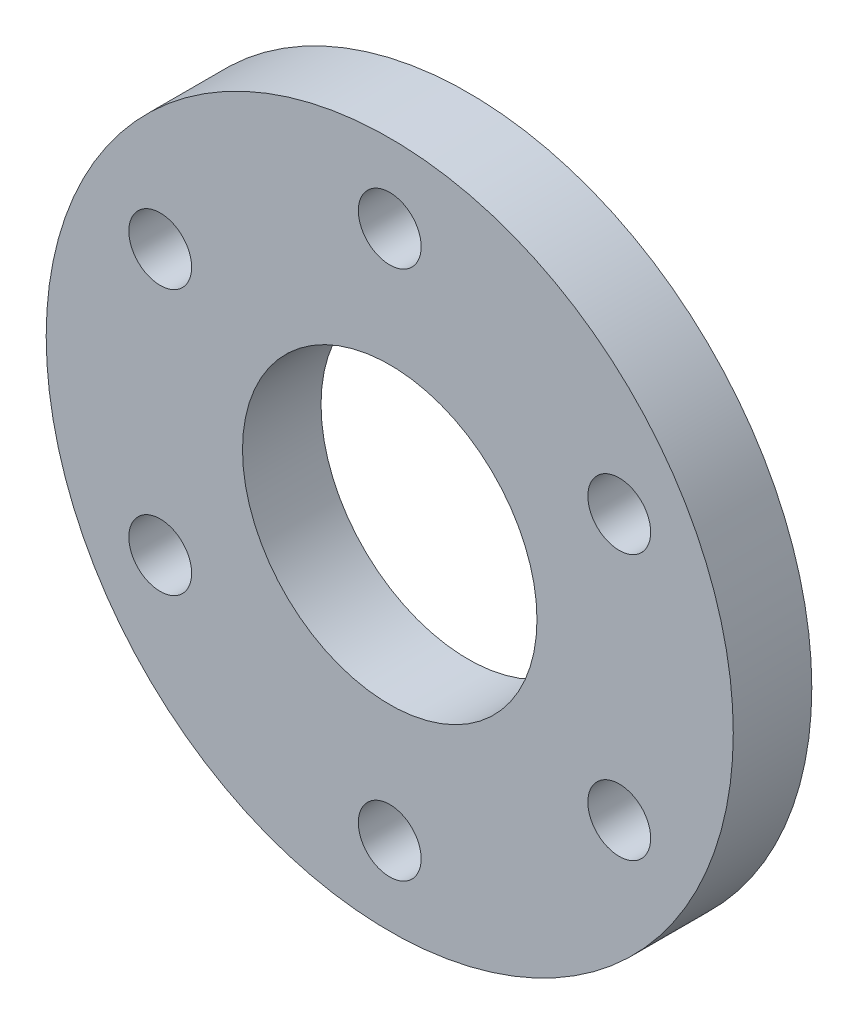
ISO-10303-21;
HEADER;
FILE_DESCRIPTION(('STEP AP214'),'2;1');
FILE_NAME('part.step','',(''),(''),'','','');
FILE_SCHEMA(('AUTOMOTIVE_DESIGN { 1 0 10303 214 1 1 1 1 }'));
ENDSEC;
DATA;
#1=APPLICATION_CONTEXT('core data for automotive mechanical design processes');
#2=APPLICATION_PROTOCOL_DEFINITION('international standard','automotive_design',2000,#1);
#3=PRODUCT_CONTEXT('',#1,'mechanical');
#4=PRODUCT('Part','Part','',(#3));
#5=PRODUCT_RELATED_PRODUCT_CATEGORY('part','',(#4));
#6=PRODUCT_DEFINITION_FORMATION('','',#4);
#7=PRODUCT_DEFINITION_CONTEXT('part definition',#1,'design');
#8=PRODUCT_DEFINITION('design','',#6,#7);
#9=PRODUCT_DEFINITION_SHAPE('','',#8);
#10=(LENGTH_UNIT() NAMED_UNIT(*) SI_UNIT(.MILLI.,.METRE.));
#11=(NAMED_UNIT(*) PLANE_ANGLE_UNIT() SI_UNIT($,.RADIAN.));
#12=(NAMED_UNIT(*) SI_UNIT($,.STERADIAN.) SOLID_ANGLE_UNIT());
#13=UNCERTAINTY_MEASURE_WITH_UNIT(LENGTH_MEASURE(1.E-05),#10,'distance_accuracy_value','');
#14=(GEOMETRIC_REPRESENTATION_CONTEXT(3) GLOBAL_UNCERTAINTY_ASSIGNED_CONTEXT((#13)) GLOBAL_UNIT_ASSIGNED_CONTEXT((#10,
#11,#12)) REPRESENTATION_CONTEXT('',''));
#15=CARTESIAN_POINT('',(0.,0.,0.));
#16=DIRECTION('',(0.,0.,1.));
#17=DIRECTION('',(1.,0.,0.));
#18=AXIS2_PLACEMENT_3D('',#15,#16,#17);
#19=CARTESIAN_POINT('',(0.,0.,4.));
#20=DIRECTION('',(0.,0.,1.));
#21=DIRECTION('',(1.,0.,0.));
#22=AXIS2_PLACEMENT_3D('',#19,#20,#21);
#23=PLANE('',#22);
#24=CARTESIAN_POINT('',(-11.6913429510899,-6.75000000000001,4.));
#25=DIRECTION('',(0.,0.,1.));
#26=DIRECTION('',(1.,0.,0.));
#27=AXIS2_PLACEMENT_3D('',#24,#25,#26);
#28=CIRCLE('',#27,1.6);
#29=CARTESIAN_POINT('',(-10.0913429510899,-6.75000000000001,4.));
#30=VERTEX_POINT('',#29);
#31=EDGE_CURVE('E79',#30,#30,#28,.T.);
#32=ORIENTED_EDGE('',*,*,#31,.F.);
#33=EDGE_LOOP('',(#32));
#34=FACE_BOUND('',#33,.T.);
#35=CARTESIAN_POINT('',(11.6913429510899,-6.75,4.));
#36=DIRECTION('',(0.,0.,1.));
#37=DIRECTION('',(1.,0.,0.));
#38=AXIS2_PLACEMENT_3D('',#35,#36,#37);
#39=CIRCLE('',#38,1.6);
#40=CARTESIAN_POINT('',(13.2913429510899,-6.75,4.));
#41=VERTEX_POINT('',#40);
#42=EDGE_CURVE('E67',#41,#41,#39,.T.);
#43=ORIENTED_EDGE('',*,*,#42,.F.);
#44=EDGE_LOOP('',(#43));
#45=FACE_BOUND('',#44,.T.);
#46=CARTESIAN_POINT('',(0.,13.5,4.));
#47=DIRECTION('',(0.,0.,1.));
#48=DIRECTION('',(1.,0.,0.));
#49=AXIS2_PLACEMENT_3D('',#46,#47,#48);
#50=CIRCLE('',#49,1.6);
#51=CARTESIAN_POINT('',(1.6,13.5,4.));
#52=VERTEX_POINT('',#51);
#53=EDGE_CURVE('E55',#52,#52,#50,.T.);
#54=ORIENTED_EDGE('',*,*,#53,.F.);
#55=EDGE_LOOP('',(#54));
#56=FACE_BOUND('',#55,.T.);
#57=CARTESIAN_POINT('',(0.,0.,4.));
#58=DIRECTION('',(0.,0.,1.));
#59=DIRECTION('',(1.,0.,0.));
#60=AXIS2_PLACEMENT_3D('',#57,#58,#59);
#61=CIRCLE('',#60,17.5);
#62=CARTESIAN_POINT('',(17.5,0.,4.));
#63=VERTEX_POINT('',#62);
#64=EDGE_CURVE('E10',#63,#63,#61,.T.);
#65=ORIENTED_EDGE('',*,*,#64,.T.);
#66=EDGE_LOOP('',(#65));
#67=FACE_BOUND('',#66,.T.);
#68=CARTESIAN_POINT('',(0.,0.,4.));
#69=DIRECTION('',(0.,0.,1.));
#70=DIRECTION('',(1.,0.,0.));
#71=AXIS2_PLACEMENT_3D('',#68,#69,#70);
#72=CIRCLE('',#71,7.5);
#73=CARTESIAN_POINT('',(7.5,0.,4.));
#74=VERTEX_POINT('',#73);
#75=EDGE_CURVE('E50',#74,#74,#72,.T.);
#76=ORIENTED_EDGE('',*,*,#75,.F.);
#77=EDGE_LOOP('',(#76));
#78=FACE_BOUND('',#77,.T.);
#79=CARTESIAN_POINT('',(11.6913429510899,6.75,4.));
#80=DIRECTION('',(0.,0.,1.));
#81=DIRECTION('',(1.,0.,0.));
#82=AXIS2_PLACEMENT_3D('',#79,#80,#81);
#83=CIRCLE('',#82,1.6);
#84=CARTESIAN_POINT('',(13.2913429510899,6.75,4.));
#85=VERTEX_POINT('',#84);
#86=EDGE_CURVE('E61',#85,#85,#83,.T.);
#87=ORIENTED_EDGE('',*,*,#86,.F.);
#88=EDGE_LOOP('',(#87));
#89=FACE_BOUND('',#88,.T.);
#90=CARTESIAN_POINT('',(0.,-13.5,4.));
#91=DIRECTION('',(0.,0.,1.));
#92=DIRECTION('',(1.,0.,0.));
#93=AXIS2_PLACEMENT_3D('',#90,#91,#92);
#94=CIRCLE('',#93,1.6);
#95=CARTESIAN_POINT('',(1.6,-13.5,4.));
#96=VERTEX_POINT('',#95);
#97=EDGE_CURVE('E73',#96,#96,#94,.T.);
#98=ORIENTED_EDGE('',*,*,#97,.F.);
#99=EDGE_LOOP('',(#98));
#100=FACE_BOUND('',#99,.T.);
#101=CARTESIAN_POINT('',(-11.6913429510899,6.75,4.));
#102=DIRECTION('',(0.,0.,1.));
#103=DIRECTION('',(1.,0.,0.));
#104=AXIS2_PLACEMENT_3D('',#101,#102,#103);
#105=CIRCLE('',#104,1.6);
#106=CARTESIAN_POINT('',(-10.0913429510899,6.75,4.));
#107=VERTEX_POINT('',#106);
#108=EDGE_CURVE('E85',#107,#107,#105,.T.);
#109=ORIENTED_EDGE('',*,*,#108,.F.);
#110=EDGE_LOOP('',(#109));
#111=FACE_BOUND('',#110,.T.);
#112=ADVANCED_FACE('F39',(#34,#45,#56,#67,#78,#89,#100,#111),#23,.T.);
#113=CARTESIAN_POINT('',(0.,0.,0.));
#114=DIRECTION('',(0.,0.,1.));
#115=DIRECTION('',(1.,0.,0.));
#116=AXIS2_PLACEMENT_3D('',#113,#114,#115);
#117=PLANE('',#116);
#118=CARTESIAN_POINT('',(0.,0.,0.));
#119=DIRECTION('',(0.,0.,1.));
#120=DIRECTION('',(1.,0.,0.));
#121=AXIS2_PLACEMENT_3D('',#118,#119,#120);
#122=CIRCLE('',#121,17.5);
#123=CARTESIAN_POINT('',(17.5,0.,0.));
#124=VERTEX_POINT('',#123);
#125=EDGE_CURVE('E43',#124,#124,#122,.T.);
#126=ORIENTED_EDGE('',*,*,#125,.F.);
#127=EDGE_LOOP('',(#126));
#128=FACE_BOUND('',#127,.T.);
#129=CARTESIAN_POINT('',(0.,0.,0.));
#130=DIRECTION('',(0.,0.,1.));
#131=DIRECTION('',(1.,0.,0.));
#132=AXIS2_PLACEMENT_3D('',#129,#130,#131);
#133=CIRCLE('',#132,7.5);
#134=CARTESIAN_POINT('',(7.5,0.,0.));
#135=VERTEX_POINT('',#134);
#136=EDGE_CURVE('E52',#135,#135,#133,.T.);
#137=ORIENTED_EDGE('',*,*,#136,.T.);
#138=EDGE_LOOP('',(#137));
#139=FACE_BOUND('',#138,.T.);
#140=CARTESIAN_POINT('',(0.,13.5,0.));
#141=DIRECTION('',(0.,0.,1.));
#142=DIRECTION('',(1.,0.,0.));
#143=AXIS2_PLACEMENT_3D('',#140,#141,#142);
#144=CIRCLE('',#143,1.6);
#145=CARTESIAN_POINT('',(1.6,13.5,0.));
#146=VERTEX_POINT('',#145);
#147=EDGE_CURVE('E58',#146,#146,#144,.T.);
#148=ORIENTED_EDGE('',*,*,#147,.T.);
#149=EDGE_LOOP('',(#148));
#150=FACE_BOUND('',#149,.T.);
#151=CARTESIAN_POINT('',(11.6913429510899,6.75,0.));
#152=DIRECTION('',(0.,0.,1.));
#153=DIRECTION('',(1.,0.,0.));
#154=AXIS2_PLACEMENT_3D('',#151,#152,#153);
#155=CIRCLE('',#154,1.6);
#156=CARTESIAN_POINT('',(13.2913429510899,6.75,0.));
#157=VERTEX_POINT('',#156);
#158=EDGE_CURVE('E64',#157,#157,#155,.T.);
#159=ORIENTED_EDGE('',*,*,#158,.T.);
#160=EDGE_LOOP('',(#159));
#161=FACE_BOUND('',#160,.T.);
#162=CARTESIAN_POINT('',(11.6913429510899,-6.75,0.));
#163=DIRECTION('',(0.,0.,1.));
#164=DIRECTION('',(1.,0.,0.));
#165=AXIS2_PLACEMENT_3D('',#162,#163,#164);
#166=CIRCLE('',#165,1.6);
#167=CARTESIAN_POINT('',(13.2913429510899,-6.75,0.));
#168=VERTEX_POINT('',#167);
#169=EDGE_CURVE('E70',#168,#168,#166,.T.);
#170=ORIENTED_EDGE('',*,*,#169,.T.);
#171=EDGE_LOOP('',(#170));
#172=FACE_BOUND('',#171,.T.);
#173=CARTESIAN_POINT('',(0.,-13.5,0.));
#174=DIRECTION('',(0.,0.,1.));
#175=DIRECTION('',(1.,0.,0.));
#176=AXIS2_PLACEMENT_3D('',#173,#174,#175);
#177=CIRCLE('',#176,1.6);
#178=CARTESIAN_POINT('',(1.6,-13.5,0.));
#179=VERTEX_POINT('',#178);
#180=EDGE_CURVE('E76',#179,#179,#177,.T.);
#181=ORIENTED_EDGE('',*,*,#180,.T.);
#182=EDGE_LOOP('',(#181));
#183=FACE_BOUND('',#182,.T.);
#184=CARTESIAN_POINT('',(-11.6913429510899,-6.75000000000001,0.));
#185=DIRECTION('',(0.,0.,1.));
#186=DIRECTION('',(1.,0.,0.));
#187=AXIS2_PLACEMENT_3D('',#184,#185,#186);
#188=CIRCLE('',#187,1.6);
#189=CARTESIAN_POINT('',(-10.0913429510899,-6.75000000000001,0.));
#190=VERTEX_POINT('',#189);
#191=EDGE_CURVE('E82',#190,#190,#188,.T.);
#192=ORIENTED_EDGE('',*,*,#191,.T.);
#193=EDGE_LOOP('',(#192));
#194=FACE_BOUND('',#193,.T.);
#195=CARTESIAN_POINT('',(-11.6913429510899,6.75,0.));
#196=DIRECTION('',(0.,0.,1.));
#197=DIRECTION('',(1.,0.,0.));
#198=AXIS2_PLACEMENT_3D('',#195,#196,#197);
#199=CIRCLE('',#198,1.6);
#200=CARTESIAN_POINT('',(-10.0913429510899,6.75,0.));
#201=VERTEX_POINT('',#200);
#202=EDGE_CURVE('E88',#201,#201,#199,.T.);
#203=ORIENTED_EDGE('',*,*,#202,.T.);
#204=EDGE_LOOP('',(#203));
#205=FACE_BOUND('',#204,.T.);
#206=ADVANCED_FACE('F98',(#128,#139,#150,#161,#172,#183,#194,#205),#117,.F.);
#207=CARTESIAN_POINT('',(0.,0.,4.));
#208=DIRECTION('',(0.,0.,-1.));
#209=DIRECTION('',(-1.,0.,0.));
#210=AXIS2_PLACEMENT_3D('',#207,#208,#209);
#211=CYLINDRICAL_SURFACE('',#210,17.5);
#212=ORIENTED_EDGE('',*,*,#64,.F.);
#213=EDGE_LOOP('',(#212));
#214=FACE_BOUND('',#213,.T.);
#215=ORIENTED_EDGE('',*,*,#125,.T.);
#216=EDGE_LOOP('',(#215));
#217=FACE_BOUND('',#216,.T.);
#218=ADVANCED_FACE('F41',(#214,#217),#211,.T.);
#219=CARTESIAN_POINT('',(0.,0.,4.));
#220=DIRECTION('',(0.,0.,-1.));
#221=DIRECTION('',(-1.,0.,0.));
#222=AXIS2_PLACEMENT_3D('',#219,#220,#221);
#223=CYLINDRICAL_SURFACE('',#222,7.5);
#224=ORIENTED_EDGE('',*,*,#75,.T.);
#225=EDGE_LOOP('',(#224));
#226=FACE_BOUND('',#225,.T.);
#227=ORIENTED_EDGE('',*,*,#136,.F.);
#228=EDGE_LOOP('',(#227));
#229=FACE_BOUND('',#228,.T.);
#230=ADVANCED_FACE('F108',(#226,#229),#223,.F.);
#231=CARTESIAN_POINT('',(0.,13.5,4.));
#232=DIRECTION('',(0.,0.,-1.));
#233=DIRECTION('',(-1.,0.,0.));
#234=AXIS2_PLACEMENT_3D('',#231,#232,#233);
#235=CYLINDRICAL_SURFACE('',#234,1.6);
#236=ORIENTED_EDGE('',*,*,#53,.T.);
#237=EDGE_LOOP('',(#236));
#238=FACE_BOUND('',#237,.T.);
#239=ORIENTED_EDGE('',*,*,#147,.F.);
#240=EDGE_LOOP('',(#239));
#241=FACE_BOUND('',#240,.T.);
#242=ADVANCED_FACE('F111',(#238,#241),#235,.F.);
#243=CARTESIAN_POINT('',(11.6913429510899,6.75,4.));
#244=DIRECTION('',(0.,0.,-1.));
#245=DIRECTION('',(-1.,0.,0.));
#246=AXIS2_PLACEMENT_3D('',#243,#244,#245);
#247=CYLINDRICAL_SURFACE('',#246,1.6);
#248=ORIENTED_EDGE('',*,*,#86,.T.);
#249=EDGE_LOOP('',(#248));
#250=FACE_BOUND('',#249,.T.);
#251=ORIENTED_EDGE('',*,*,#158,.F.);
#252=EDGE_LOOP('',(#251));
#253=FACE_BOUND('',#252,.T.);
#254=ADVANCED_FACE('F115',(#250,#253),#247,.F.);
#255=CARTESIAN_POINT('',(11.6913429510899,-6.75,4.));
#256=DIRECTION('',(0.,0.,-1.));
#257=DIRECTION('',(-1.,0.,0.));
#258=AXIS2_PLACEMENT_3D('',#255,#256,#257);
#259=CYLINDRICAL_SURFACE('',#258,1.6);
#260=ORIENTED_EDGE('',*,*,#42,.T.);
#261=EDGE_LOOP('',(#260));
#262=FACE_BOUND('',#261,.T.);
#263=ORIENTED_EDGE('',*,*,#169,.F.);
#264=EDGE_LOOP('',(#263));
#265=FACE_BOUND('',#264,.T.);
#266=ADVANCED_FACE('F119',(#262,#265),#259,.F.);
#267=CARTESIAN_POINT('',(0.,-13.5,4.));
#268=DIRECTION('',(0.,0.,-1.));
#269=DIRECTION('',(-1.,0.,0.));
#270=AXIS2_PLACEMENT_3D('',#267,#268,#269);
#271=CYLINDRICAL_SURFACE('',#270,1.6);
#272=ORIENTED_EDGE('',*,*,#97,.T.);
#273=EDGE_LOOP('',(#272));
#274=FACE_BOUND('',#273,.T.);
#275=ORIENTED_EDGE('',*,*,#180,.F.);
#276=EDGE_LOOP('',(#275));
#277=FACE_BOUND('',#276,.T.);
#278=ADVANCED_FACE('F123',(#274,#277),#271,.F.);
#279=CARTESIAN_POINT('',(-11.6913429510899,-6.75000000000001,4.));
#280=DIRECTION('',(0.,0.,-1.));
#281=DIRECTION('',(-1.,0.,0.));
#282=AXIS2_PLACEMENT_3D('',#279,#280,#281);
#283=CYLINDRICAL_SURFACE('',#282,1.6);
#284=ORIENTED_EDGE('',*,*,#31,.T.);
#285=EDGE_LOOP('',(#284));
#286=FACE_BOUND('',#285,.T.);
#287=ORIENTED_EDGE('',*,*,#191,.F.);
#288=EDGE_LOOP('',(#287));
#289=FACE_BOUND('',#288,.T.);
#290=ADVANCED_FACE('F127',(#286,#289),#283,.F.);
#291=CARTESIAN_POINT('',(-11.6913429510899,6.75,4.));
#292=DIRECTION('',(0.,0.,-1.));
#293=DIRECTION('',(-1.,0.,0.));
#294=AXIS2_PLACEMENT_3D('',#291,#292,#293);
#295=CYLINDRICAL_SURFACE('',#294,1.6);
#296=ORIENTED_EDGE('',*,*,#108,.T.);
#297=EDGE_LOOP('',(#296));
#298=FACE_BOUND('',#297,.T.);
#299=ORIENTED_EDGE('',*,*,#202,.F.);
#300=EDGE_LOOP('',(#299));
#301=FACE_BOUND('',#300,.T.);
#302=ADVANCED_FACE('F94',(#298,#301),#295,.F.);
#303=CLOSED_SHELL('',(#112,#206,#218,#230,#242,#254,#266,#278,#290,#302));
#304=MANIFOLD_SOLID_BREP('B2',#303);
#305=ADVANCED_BREP_SHAPE_REPRESENTATION('',(#18,#304),#14);
#306=SHAPE_DEFINITION_REPRESENTATION(#9,#305);
ENDSEC;
END-ISO-10303-21;
